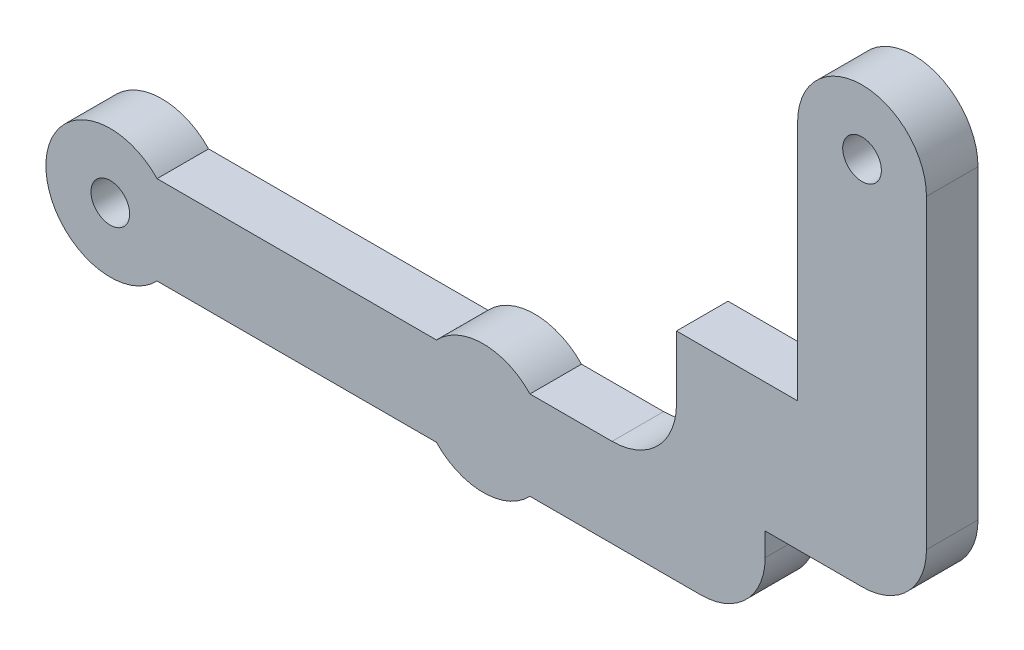
ISO-10303-21;
HEADER;
FILE_DESCRIPTION(('STEP AP214'),'2;1');
FILE_NAME('part.step','',(''),(''),'','','');
FILE_SCHEMA(('AUTOMOTIVE_DESIGN { 1 0 10303 214 1 1 1 1 }'));
ENDSEC;
DATA;
#1=APPLICATION_CONTEXT('core data for automotive mechanical design processes');
#2=APPLICATION_PROTOCOL_DEFINITION('international standard','automotive_design',2000,#1);
#3=PRODUCT_CONTEXT('',#1,'mechanical');
#4=PRODUCT('Part','Part','',(#3));
#5=PRODUCT_RELATED_PRODUCT_CATEGORY('part','',(#4));
#6=PRODUCT_DEFINITION_FORMATION('','',#4);
#7=PRODUCT_DEFINITION_CONTEXT('part definition',#1,'design');
#8=PRODUCT_DEFINITION('design','',#6,#7);
#9=PRODUCT_DEFINITION_SHAPE('','',#8);
#10=(LENGTH_UNIT() NAMED_UNIT(*) SI_UNIT(.MILLI.,.METRE.));
#11=(NAMED_UNIT(*) PLANE_ANGLE_UNIT() SI_UNIT($,.RADIAN.));
#12=(NAMED_UNIT(*) SI_UNIT($,.STERADIAN.) SOLID_ANGLE_UNIT());
#13=UNCERTAINTY_MEASURE_WITH_UNIT(LENGTH_MEASURE(1.E-05),#10,'distance_accuracy_value','');
#14=(GEOMETRIC_REPRESENTATION_CONTEXT(3) GLOBAL_UNCERTAINTY_ASSIGNED_CONTEXT((#13)) GLOBAL_UNIT_ASSIGNED_CONTEXT((#10,
#11,#12)) REPRESENTATION_CONTEXT('',''));
#15=CARTESIAN_POINT('',(0.,0.,0.));
#16=DIRECTION('',(0.,0.,1.));
#17=DIRECTION('',(1.,0.,0.));
#18=AXIS2_PLACEMENT_3D('',#15,#16,#17);
#19=CARTESIAN_POINT('',(29.9959228132225,-17.400123785271,4.));
#20=DIRECTION('',(0.,0.,-1.));
#21=DIRECTION('',(-1.,0.,0.));
#22=AXIS2_PLACEMENT_3D('',#19,#20,#21);
#23=CYLINDRICAL_SURFACE('',#22,1.5);
#24=CARTESIAN_POINT('',(29.9959228132225,-17.400123785271,0.));
#25=DIRECTION('',(0.,0.,1.));
#26=DIRECTION('',(1.,0.,0.));
#27=AXIS2_PLACEMENT_3D('',#24,#25,#26);
#28=CIRCLE('',#27,1.5);
#29=CARTESIAN_POINT('',(31.4959228132225,-17.400123785271,0.));
#30=VERTEX_POINT('',#29);
#31=EDGE_CURVE('E355',#30,#30,#28,.T.);
#32=ORIENTED_EDGE('',*,*,#31,.F.);
#33=EDGE_LOOP('',(#32));
#34=FACE_BOUND('',#33,.T.);
#35=CARTESIAN_POINT('',(29.9959228132225,-17.400123785271,3.));
#36=DIRECTION('',(0.,0.,1.));
#37=DIRECTION('',(1.,0.,0.));
#38=AXIS2_PLACEMENT_3D('',#35,#36,#37);
#39=CIRCLE('',#38,1.5);
#40=CARTESIAN_POINT('',(31.4959228132225,-17.400123785271,3.));
#41=VERTEX_POINT('',#40);
#42=EDGE_CURVE('E384',#41,#41,#39,.T.);
#43=ORIENTED_EDGE('',*,*,#42,.T.);
#44=EDGE_LOOP('',(#43));
#45=FACE_BOUND('',#44,.T.);
#46=ADVANCED_FACE('F37',(#34,#45),#23,.F.);
#47=CARTESIAN_POINT('',(59.3959228132225,-9.04012378527096,4.));
#48=DIRECTION('',(0.,0.,-1.));
#49=DIRECTION('',(-1.,0.,0.));
#50=AXIS2_PLACEMENT_3D('',#47,#48,#49);
#51=CYLINDRICAL_SURFACE('',#50,1.5);
#52=CARTESIAN_POINT('',(59.3959228132225,-9.04012378527096,0.));
#53=DIRECTION('',(0.,0.,1.));
#54=DIRECTION('',(1.,0.,0.));
#55=AXIS2_PLACEMENT_3D('',#52,#53,#54);
#56=CIRCLE('',#55,1.5);
#57=CARTESIAN_POINT('',(60.8959228132225,-9.04012378527096,0.));
#58=VERTEX_POINT('',#57);
#59=EDGE_CURVE('E193',#58,#58,#56,.T.);
#60=ORIENTED_EDGE('',*,*,#59,.F.);
#61=EDGE_LOOP('',(#60));
#62=FACE_BOUND('',#61,.T.);
#63=CARTESIAN_POINT('',(59.3959228132225,-9.04012378527096,3.));
#64=DIRECTION('',(0.,0.,1.));
#65=DIRECTION('',(1.,0.,0.));
#66=AXIS2_PLACEMENT_3D('',#63,#64,#65);
#67=CIRCLE('',#66,1.5);
#68=CARTESIAN_POINT('',(60.8959228132225,-9.04012378527096,3.));
#69=VERTEX_POINT('',#68);
#70=EDGE_CURVE('E381',#69,#69,#67,.T.);
#71=ORIENTED_EDGE('',*,*,#70,.T.);
#72=EDGE_LOOP('',(#71));
#73=FACE_BOUND('',#72,.T.);
#74=ADVANCED_FACE('F329',(#62,#73),#51,.F.);
#75=CARTESIAN_POINT('',(59.3959228132225,1.23987621472904,4.));
#76=DIRECTION('',(0.,0.,-1.));
#77=DIRECTION('',(-1.,0.,0.));
#78=AXIS2_PLACEMENT_3D('',#75,#76,#77);
#79=CYLINDRICAL_SURFACE('',#78,1.5);
#80=CARTESIAN_POINT('',(59.3959228132225,1.23987621472904,0.));
#81=DIRECTION('',(0.,0.,1.));
#82=DIRECTION('',(1.,0.,0.));
#83=AXIS2_PLACEMENT_3D('',#80,#81,#82);
#84=CIRCLE('',#83,1.5);
#85=CARTESIAN_POINT('',(60.8959228132225,1.23987621472904,0.));
#86=VERTEX_POINT('',#85);
#87=EDGE_CURVE('E358',#86,#86,#84,.T.);
#88=ORIENTED_EDGE('',*,*,#87,.F.);
#89=EDGE_LOOP('',(#88));
#90=FACE_BOUND('',#89,.T.);
#91=CARTESIAN_POINT('',(59.3959228132225,1.23987621472904,3.));
#92=DIRECTION('',(0.,0.,1.));
#93=DIRECTION('',(1.,0.,0.));
#94=AXIS2_PLACEMENT_3D('',#91,#92,#93);
#95=CIRCLE('',#94,1.5);
#96=CARTESIAN_POINT('',(60.8959228132225,1.23987621472904,3.));
#97=VERTEX_POINT('',#96);
#98=EDGE_CURVE('E376',#97,#97,#95,.T.);
#99=ORIENTED_EDGE('',*,*,#98,.T.);
#100=EDGE_LOOP('',(#99));
#101=FACE_BOUND('',#100,.T.);
#102=ADVANCED_FACE('F335',(#90,#101),#79,.F.);
#103=CARTESIAN_POINT('',(59.3959228132225,-9.04012378527096,4.));
#104=DIRECTION('',(0.,0.,-1.));
#105=DIRECTION('',(-1.,0.,0.));
#106=AXIS2_PLACEMENT_3D('',#103,#104,#105);
#107=PLANE('',#106);
#108=DIRECTION('',(0.,1.,0.));
#109=VECTOR('',#108,1.);
#110=CARTESIAN_POINT('',(51.8759228132224,-15.840123785271,4.));
#111=LINE('',#110,#109);
#112=CARTESIAN_POINT('',(51.8759228132225,-15.840123785271,4.));
#113=VERTEX_POINT('',#112);
#114=CARTESIAN_POINT('',(51.8759228132224,-14.040123785271,4.));
#115=VERTEX_POINT('',#114);
#116=EDGE_CURVE('E222',#113,#115,#111,.T.);
#117=ORIENTED_EDGE('',*,*,#116,.T.);
#118=DIRECTION('',(1.,0.,0.));
#119=VECTOR('',#118,1.);
#120=CARTESIAN_POINT('',(51.8759228132224,-14.040123785271,4.));
#121=LINE('',#120,#119);
#122=CARTESIAN_POINT('',(59.3959228132225,-14.040123785271,4.));
#123=VERTEX_POINT('',#122);
#124=EDGE_CURVE('E124',#115,#123,#121,.T.);
#125=ORIENTED_EDGE('',*,*,#124,.T.);
#126=CARTESIAN_POINT('',(59.3959228132225,-9.04012378527096,4.));
#127=DIRECTION('',(0.,0.,1.));
#128=DIRECTION('',(-1.,0.,0.));
#129=AXIS2_PLACEMENT_3D('',#126,#127,#128);
#130=CIRCLE('',#129,5.);
#131=CARTESIAN_POINT('',(64.3959228132225,-9.04012378527096,4.));
#132=VERTEX_POINT('',#131);
#133=EDGE_CURVE('E264',#123,#132,#130,.T.);
#134=ORIENTED_EDGE('',*,*,#133,.T.);
#135=DIRECTION('',(0.,1.,0.));
#136=VECTOR('',#135,1.);
#137=CARTESIAN_POINT('',(64.3959228132225,-9.04012378527096,4.));
#138=LINE('',#137,#136);
#139=CARTESIAN_POINT('',(64.3959228132225,14.6998762147291,4.));
#140=VERTEX_POINT('',#139);
#141=EDGE_CURVE('E283',#132,#140,#138,.T.);
#142=ORIENTED_EDGE('',*,*,#141,.T.);
#143=CARTESIAN_POINT('',(59.3959228132225,14.6998762147291,4.));
#144=DIRECTION('',(0.,0.,1.));
#145=DIRECTION('',(1.,0.,0.));
#146=AXIS2_PLACEMENT_3D('',#143,#144,#145);
#147=CIRCLE('',#146,4.99999999999999);
#148=CARTESIAN_POINT('',(54.3959228132225,14.6998762147291,4.));
#149=VERTEX_POINT('',#148);
#150=EDGE_CURVE('E280',#140,#149,#147,.T.);
#151=ORIENTED_EDGE('',*,*,#150,.T.);
#152=DIRECTION('',(0.,-1.,0.));
#153=VECTOR('',#152,1.);
#154=CARTESIAN_POINT('',(54.3959228132225,14.6998762147291,4.));
#155=LINE('',#154,#153);
#156=CARTESIAN_POINT('',(54.3959228132225,-4.04012378527096,4.));
#157=VERTEX_POINT('',#156);
#158=EDGE_CURVE('E282',#149,#157,#155,.T.);
#159=ORIENTED_EDGE('',*,*,#158,.T.);
#160=DIRECTION('',(-1.,0.,0.));
#161=VECTOR('',#160,1.);
#162=CARTESIAN_POINT('',(54.3959228132225,-4.04012378527096,4.));
#163=LINE('',#162,#161);
#164=CARTESIAN_POINT('',(44.9959228132224,-4.04012378527096,4.));
#165=VERTEX_POINT('',#164);
#166=EDGE_CURVE('E285',#157,#165,#163,.T.);
#167=ORIENTED_EDGE('',*,*,#166,.T.);
#168=DIRECTION('',(0.,-1.,0.));
#169=VECTOR('',#168,1.);
#170=CARTESIAN_POINT('',(44.9959228132224,-4.04012378527096,4.));
#171=LINE('',#170,#169);
#172=CARTESIAN_POINT('',(44.9959228132225,-8.96012378527096,4.));
#173=VERTEX_POINT('',#172);
#174=EDGE_CURVE('E291',#165,#173,#171,.T.);
#175=ORIENTED_EDGE('',*,*,#174,.T.);
#176=CARTESIAN_POINT('',(39.9959228132224,-8.96012378527096,4.));
#177=DIRECTION('',(0.,0.,-1.));
#178=DIRECTION('',(-1.,0.,0.));
#179=AXIS2_PLACEMENT_3D('',#176,#177,#178);
#180=CIRCLE('',#179,5.);
#181=CARTESIAN_POINT('',(39.9959228132224,-13.960123785271,4.));
#182=VERTEX_POINT('',#181);
#183=EDGE_CURVE('E293',#173,#182,#180,.T.);
#184=ORIENTED_EDGE('',*,*,#183,.T.);
#185=DIRECTION('',(-1.,0.,0.));
#186=VECTOR('',#185,1.);
#187=CARTESIAN_POINT('',(39.9959228132224,-13.960123785271,4.));
#188=LINE('',#187,#186);
#189=CARTESIAN_POINT('',(33.624476243999,-13.960123785271,4.));
#190=VERTEX_POINT('',#189);
#191=EDGE_CURVE('E295',#182,#190,#188,.T.);
#192=ORIENTED_EDGE('',*,*,#191,.T.);
#193=CARTESIAN_POINT('',(29.9959228132225,-17.400123785271,4.));
#194=DIRECTION('',(0.,0.,1.));
#195=DIRECTION('',(1.,0.,0.));
#196=AXIS2_PLACEMENT_3D('',#193,#194,#195);
#197=CIRCLE('',#196,4.99999999999999);
#198=CARTESIAN_POINT('',(26.367369382446,-13.960123785271,4.));
#199=VERTEX_POINT('',#198);
#200=EDGE_CURVE('E297',#190,#199,#197,.T.);
#201=ORIENTED_EDGE('',*,*,#200,.T.);
#202=DIRECTION('',(-1.,0.,0.));
#203=VECTOR('',#202,1.);
#204=CARTESIAN_POINT('',(26.367369382446,-13.960123785271,4.));
#205=LINE('',#204,#203);
#206=CARTESIAN_POINT('',(4.68447624399896,-13.960123785271,4.));
#207=VERTEX_POINT('',#206);
#208=EDGE_CURVE('E299',#199,#207,#205,.T.);
#209=ORIENTED_EDGE('',*,*,#208,.T.);
#210=CARTESIAN_POINT('',(1.05592281322246,-17.400123785271,4.));
#211=DIRECTION('',(0.,0.,1.));
#212=DIRECTION('',(1.,0.,0.));
#213=AXIS2_PLACEMENT_3D('',#210,#211,#212);
#214=CIRCLE('',#213,4.99999999999999);
#215=CARTESIAN_POINT('',(4.68447624399895,-20.840123785271,4.));
#216=VERTEX_POINT('',#215);
#217=EDGE_CURVE('E301',#207,#216,#214,.T.);
#218=ORIENTED_EDGE('',*,*,#217,.T.);
#219=DIRECTION('',(1.,0.,0.));
#220=VECTOR('',#219,1.);
#221=CARTESIAN_POINT('',(4.68447624399896,-20.840123785271,4.));
#222=LINE('',#221,#220);
#223=CARTESIAN_POINT('',(26.367369382446,-20.840123785271,4.));
#224=VERTEX_POINT('',#223);
#225=EDGE_CURVE('E171',#216,#224,#222,.T.);
#226=ORIENTED_EDGE('',*,*,#225,.T.);
#227=CARTESIAN_POINT('',(29.9959228132225,-17.400123785271,4.));
#228=DIRECTION('',(0.,0.,1.));
#229=DIRECTION('',(1.,0.,0.));
#230=AXIS2_PLACEMENT_3D('',#227,#228,#229);
#231=CIRCLE('',#230,4.99999999999999);
#232=CARTESIAN_POINT('',(33.624476243999,-20.840123785271,4.));
#233=VERTEX_POINT('',#232);
#234=EDGE_CURVE('E164',#224,#233,#231,.T.);
#235=ORIENTED_EDGE('',*,*,#234,.T.);
#236=DIRECTION('',(1.,0.,0.));
#237=VECTOR('',#236,1.);
#238=CARTESIAN_POINT('',(33.624476243999,-20.840123785271,4.));
#239=LINE('',#238,#237);
#240=CARTESIAN_POINT('',(46.8759228132224,-20.840123785271,4.));
#241=VERTEX_POINT('',#240);
#242=EDGE_CURVE('E169',#233,#241,#239,.T.);
#243=ORIENTED_EDGE('',*,*,#242,.T.);
#244=CARTESIAN_POINT('',(46.8759228132224,-15.840123785271,4.));
#245=DIRECTION('',(0.,0.,1.));
#246=DIRECTION('',(-1.,0.,0.));
#247=AXIS2_PLACEMENT_3D('',#244,#245,#246);
#248=CIRCLE('',#247,5.);
#249=EDGE_CURVE('E54',#241,#113,#248,.T.);
#250=ORIENTED_EDGE('',*,*,#249,.T.);
#251=EDGE_LOOP('',(#117,#125,#134,#142,#151,#159,#167,#175,#184,#192,#201,#209,#218,#226,#235,
#243,#250));
#252=FACE_BOUND('',#251,.T.);
#253=CARTESIAN_POINT('',(59.3959228132225,14.6998762147291,4.));
#254=DIRECTION('',(0.,0.,1.));
#255=DIRECTION('',(1.,0.,0.));
#256=AXIS2_PLACEMENT_3D('',#253,#254,#255);
#257=CIRCLE('',#256,1.5);
#258=CARTESIAN_POINT('',(60.8959228132225,14.6998762147291,4.));
#259=VERTEX_POINT('',#258);
#260=EDGE_CURVE('E359',#259,#259,#257,.T.);
#261=ORIENTED_EDGE('',*,*,#260,.F.);
#262=EDGE_LOOP('',(#261));
#263=FACE_BOUND('',#262,.T.);
#264=CARTESIAN_POINT('',(1.05592281322246,-17.400123785271,4.));
#265=DIRECTION('',(0.,0.,1.));
#266=DIRECTION('',(1.,0.,0.));
#267=AXIS2_PLACEMENT_3D('',#264,#265,#266);
#268=CIRCLE('',#267,1.5);
#269=CARTESIAN_POINT('',(2.55592281322246,-17.400123785271,4.));
#270=VERTEX_POINT('',#269);
#271=EDGE_CURVE('E372',#270,#270,#268,.T.);
#272=ORIENTED_EDGE('',*,*,#271,.F.);
#273=EDGE_LOOP('',(#272));
#274=FACE_BOUND('',#273,.T.);
#275=ADVANCED_FACE('F166',(#252,#263,#274),#107,.F.);
#276=CARTESIAN_POINT('',(59.3959228132225,-9.04012378527096,0.));
#277=DIRECTION('',(0.,0.,-1.));
#278=DIRECTION('',(-1.,0.,0.));
#279=AXIS2_PLACEMENT_3D('',#276,#277,#278);
#280=PLANE('',#279);
#281=ORIENTED_EDGE('',*,*,#31,.T.);
#282=EDGE_LOOP('',(#281));
#283=FACE_BOUND('',#282,.T.);
#284=ORIENTED_EDGE('',*,*,#87,.T.);
#285=EDGE_LOOP('',(#284));
#286=FACE_BOUND('',#285,.T.);
#287=DIRECTION('',(0.,1.,0.));
#288=VECTOR('',#287,1.);
#289=CARTESIAN_POINT('',(51.8759228132224,-15.840123785271,0.));
#290=LINE('',#289,#288);
#291=CARTESIAN_POINT('',(51.8759228132225,-15.840123785271,0.));
#292=VERTEX_POINT('',#291);
#293=CARTESIAN_POINT('',(51.8759228132224,-14.040123785271,0.));
#294=VERTEX_POINT('',#293);
#295=EDGE_CURVE('E189',#292,#294,#290,.T.);
#296=ORIENTED_EDGE('',*,*,#295,.F.);
#297=CARTESIAN_POINT('',(46.8759228132224,-15.840123785271,0.));
#298=DIRECTION('',(0.,0.,1.));
#299=DIRECTION('',(-1.,0.,0.));
#300=AXIS2_PLACEMENT_3D('',#297,#298,#299);
#301=CIRCLE('',#300,5.);
#302=CARTESIAN_POINT('',(46.8759228132224,-20.840123785271,0.));
#303=VERTEX_POINT('',#302);
#304=EDGE_CURVE('E116',#303,#292,#301,.T.);
#305=ORIENTED_EDGE('',*,*,#304,.F.);
#306=DIRECTION('',(1.,0.,0.));
#307=VECTOR('',#306,1.);
#308=CARTESIAN_POINT('',(33.624476243999,-20.840123785271,0.));
#309=LINE('',#308,#307);
#310=CARTESIAN_POINT('',(33.624476243999,-20.840123785271,0.));
#311=VERTEX_POINT('',#310);
#312=EDGE_CURVE('E110',#311,#303,#309,.T.);
#313=ORIENTED_EDGE('',*,*,#312,.F.);
#314=CARTESIAN_POINT('',(29.9959228132225,-17.400123785271,0.));
#315=DIRECTION('',(0.,0.,1.));
#316=DIRECTION('',(1.,0.,0.));
#317=AXIS2_PLACEMENT_3D('',#314,#315,#316);
#318=CIRCLE('',#317,4.99999999999999);
#319=CARTESIAN_POINT('',(26.367369382446,-20.840123785271,0.));
#320=VERTEX_POINT('',#319);
#321=EDGE_CURVE('E179',#320,#311,#318,.T.);
#322=ORIENTED_EDGE('',*,*,#321,.F.);
#323=DIRECTION('',(1.,0.,0.));
#324=VECTOR('',#323,1.);
#325=CARTESIAN_POINT('',(4.68447624399896,-20.840123785271,0.));
#326=LINE('',#325,#324);
#327=CARTESIAN_POINT('',(4.68447624399895,-20.840123785271,0.));
#328=VERTEX_POINT('',#327);
#329=EDGE_CURVE('E217',#328,#320,#326,.T.);
#330=ORIENTED_EDGE('',*,*,#329,.F.);
#331=CARTESIAN_POINT('',(1.05592281322246,-17.400123785271,0.));
#332=DIRECTION('',(0.,0.,1.));
#333=DIRECTION('',(1.,0.,0.));
#334=AXIS2_PLACEMENT_3D('',#331,#332,#333);
#335=CIRCLE('',#334,4.99999999999999);
#336=CARTESIAN_POINT('',(4.68447624399896,-13.960123785271,0.));
#337=VERTEX_POINT('',#336);
#338=EDGE_CURVE('E215',#337,#328,#335,.T.);
#339=ORIENTED_EDGE('',*,*,#338,.F.);
#340=DIRECTION('',(-1.,0.,0.));
#341=VECTOR('',#340,1.);
#342=CARTESIAN_POINT('',(26.367369382446,-13.960123785271,0.));
#343=LINE('',#342,#341);
#344=CARTESIAN_POINT('',(26.367369382446,-13.960123785271,0.));
#345=VERTEX_POINT('',#344);
#346=EDGE_CURVE('E213',#345,#337,#343,.T.);
#347=ORIENTED_EDGE('',*,*,#346,.F.);
#348=CARTESIAN_POINT('',(29.9959228132225,-17.400123785271,0.));
#349=DIRECTION('',(0.,0.,1.));
#350=DIRECTION('',(1.,0.,0.));
#351=AXIS2_PLACEMENT_3D('',#348,#349,#350);
#352=CIRCLE('',#351,4.99999999999999);
#353=CARTESIAN_POINT('',(33.624476243999,-13.960123785271,0.));
#354=VERTEX_POINT('',#353);
#355=EDGE_CURVE('E211',#354,#345,#352,.T.);
#356=ORIENTED_EDGE('',*,*,#355,.F.);
#357=DIRECTION('',(-1.,0.,0.));
#358=VECTOR('',#357,1.);
#359=CARTESIAN_POINT('',(39.9959228132224,-13.960123785271,0.));
#360=LINE('',#359,#358);
#361=CARTESIAN_POINT('',(39.9959228132224,-13.960123785271,0.));
#362=VERTEX_POINT('',#361);
#363=EDGE_CURVE('E209',#362,#354,#360,.T.);
#364=ORIENTED_EDGE('',*,*,#363,.F.);
#365=CARTESIAN_POINT('',(39.9959228132224,-8.96012378527096,0.));
#366=DIRECTION('',(0.,0.,-1.));
#367=DIRECTION('',(-1.,0.,0.));
#368=AXIS2_PLACEMENT_3D('',#365,#366,#367);
#369=CIRCLE('',#368,5.);
#370=CARTESIAN_POINT('',(44.9959228132225,-8.96012378527096,0.));
#371=VERTEX_POINT('',#370);
#372=EDGE_CURVE('E207',#371,#362,#369,.T.);
#373=ORIENTED_EDGE('',*,*,#372,.F.);
#374=DIRECTION('',(0.,-1.,0.));
#375=VECTOR('',#374,1.);
#376=CARTESIAN_POINT('',(44.9959228132224,-4.04012378527096,0.));
#377=LINE('',#376,#375);
#378=CARTESIAN_POINT('',(44.9959228132224,-4.04012378527096,0.));
#379=VERTEX_POINT('',#378);
#380=EDGE_CURVE('E205',#379,#371,#377,.T.);
#381=ORIENTED_EDGE('',*,*,#380,.F.);
#382=DIRECTION('',(-1.,0.,0.));
#383=VECTOR('',#382,1.);
#384=CARTESIAN_POINT('',(54.3959228132225,-4.04012378527096,0.));
#385=LINE('',#384,#383);
#386=CARTESIAN_POINT('',(54.3959228132225,-4.04012378527096,0.));
#387=VERTEX_POINT('',#386);
#388=EDGE_CURVE('E203',#387,#379,#385,.T.);
#389=ORIENTED_EDGE('',*,*,#388,.F.);
#390=DIRECTION('',(0.,-1.,0.));
#391=VECTOR('',#390,1.);
#392=CARTESIAN_POINT('',(54.3959228132225,14.6998762147291,0.));
#393=LINE('',#392,#391);
#394=CARTESIAN_POINT('',(54.3959228132225,14.6998762147291,0.));
#395=VERTEX_POINT('',#394);
#396=EDGE_CURVE('E201',#395,#387,#393,.T.);
#397=ORIENTED_EDGE('',*,*,#396,.F.);
#398=CARTESIAN_POINT('',(59.3959228132225,14.6998762147291,0.));
#399=DIRECTION('',(0.,0.,1.));
#400=DIRECTION('',(1.,0.,0.));
#401=AXIS2_PLACEMENT_3D('',#398,#399,#400);
#402=CIRCLE('',#401,4.99999999999999);
#403=CARTESIAN_POINT('',(64.3959228132225,14.6998762147291,0.));
#404=VERTEX_POINT('',#403);
#405=EDGE_CURVE('E199',#404,#395,#402,.T.);
#406=ORIENTED_EDGE('',*,*,#405,.F.);
#407=DIRECTION('',(0.,1.,0.));
#408=VECTOR('',#407,1.);
#409=CARTESIAN_POINT('',(64.3959228132225,-9.04012378527096,0.));
#410=LINE('',#409,#408);
#411=CARTESIAN_POINT('',(64.3959228132225,-9.04012378527096,0.));
#412=VERTEX_POINT('',#411);
#413=EDGE_CURVE('E197',#412,#404,#410,.T.);
#414=ORIENTED_EDGE('',*,*,#413,.F.);
#415=CARTESIAN_POINT('',(59.3959228132225,-9.04012378527096,0.));
#416=DIRECTION('',(0.,0.,1.));
#417=DIRECTION('',(-1.,0.,0.));
#418=AXIS2_PLACEMENT_3D('',#415,#416,#417);
#419=CIRCLE('',#418,5.);
#420=CARTESIAN_POINT('',(59.3959228132225,-14.040123785271,0.));
#421=VERTEX_POINT('',#420);
#422=EDGE_CURVE('E195',#421,#412,#419,.T.);
#423=ORIENTED_EDGE('',*,*,#422,.F.);
#424=DIRECTION('',(1.,0.,0.));
#425=VECTOR('',#424,1.);
#426=CARTESIAN_POINT('',(51.8759228132224,-14.040123785271,0.));
#427=LINE('',#426,#425);
#428=EDGE_CURVE('E192',#294,#421,#427,.T.);
#429=ORIENTED_EDGE('',*,*,#428,.F.);
#430=EDGE_LOOP('',(#296,#305,#313,#322,#330,#339,#347,#356,#364,#373,#381,#389,#397,#406,#414,
#423,#429));
#431=FACE_BOUND('',#430,.T.);
#432=ORIENTED_EDGE('',*,*,#59,.T.);
#433=EDGE_LOOP('',(#432));
#434=FACE_BOUND('',#433,.T.);
#435=CARTESIAN_POINT('',(59.3959228132225,14.6998762147291,0.));
#436=DIRECTION('',(0.,0.,1.));
#437=DIRECTION('',(1.,0.,0.));
#438=AXIS2_PLACEMENT_3D('',#435,#436,#437);
#439=CIRCLE('',#438,1.5);
#440=CARTESIAN_POINT('',(60.8959228132225,14.6998762147291,0.));
#441=VERTEX_POINT('',#440);
#442=EDGE_CURVE('E364',#441,#441,#439,.T.);
#443=ORIENTED_EDGE('',*,*,#442,.T.);
#444=EDGE_LOOP('',(#443));
#445=FACE_BOUND('',#444,.T.);
#446=CARTESIAN_POINT('',(1.05592281322246,-17.400123785271,0.));
#447=DIRECTION('',(0.,0.,1.));
#448=DIRECTION('',(1.,0.,0.));
#449=AXIS2_PLACEMENT_3D('',#446,#447,#448);
#450=CIRCLE('',#449,1.5);
#451=CARTESIAN_POINT('',(2.55592281322246,-17.400123785271,0.));
#452=VERTEX_POINT('',#451);
#453=EDGE_CURVE('E373',#452,#452,#450,.T.);
#454=ORIENTED_EDGE('',*,*,#453,.T.);
#455=EDGE_LOOP('',(#454));
#456=FACE_BOUND('',#455,.T.);
#457=ADVANCED_FACE('F268',(#283,#286,#431,#434,#445,#456),#280,.T.);
#458=CARTESIAN_POINT('',(51.8759228132224,-15.840123785271,4.));
#459=DIRECTION('',(-1.,0.,0.));
#460=DIRECTION('',(0.,0.,1.));
#461=AXIS2_PLACEMENT_3D('',#458,#459,#460);
#462=PLANE('',#461);
#463=ORIENTED_EDGE('',*,*,#295,.T.);
#464=DIRECTION('',(0.,0.,-1.));
#465=VECTOR('',#464,1.);
#466=CARTESIAN_POINT('',(51.8759228132224,-14.040123785271,4.));
#467=LINE('',#466,#465);
#468=EDGE_CURVE('E11',#115,#294,#467,.T.);
#469=ORIENTED_EDGE('',*,*,#468,.F.);
#470=ORIENTED_EDGE('',*,*,#116,.F.);
#471=DIRECTION('',(0.,0.,-1.));
#472=VECTOR('',#471,1.);
#473=CARTESIAN_POINT('',(51.8759228132225,-15.840123785271,4.));
#474=LINE('',#473,#472);
#475=EDGE_CURVE('E185',#113,#292,#474,.T.);
#476=ORIENTED_EDGE('',*,*,#475,.T.);
#477=EDGE_LOOP('',(#463,#469,#470,#476));
#478=FACE_BOUND('',#477,.T.);
#479=ADVANCED_FACE('F39',(#478),#462,.F.);
#480=CARTESIAN_POINT('',(51.8759228132224,-14.040123785271,4.));
#481=DIRECTION('',(0.,1.,0.));
#482=DIRECTION('',(-1.,0.,0.));
#483=AXIS2_PLACEMENT_3D('',#480,#481,#482);
#484=PLANE('',#483);
#485=ORIENTED_EDGE('',*,*,#428,.T.);
#486=DIRECTION('',(0.,0.,-1.));
#487=VECTOR('',#486,1.);
#488=CARTESIAN_POINT('',(59.3959228132225,-14.040123785271,4.));
#489=LINE('',#488,#487);
#490=EDGE_CURVE('E46',#123,#421,#489,.T.);
#491=ORIENTED_EDGE('',*,*,#490,.F.);
#492=ORIENTED_EDGE('',*,*,#124,.F.);
#493=ORIENTED_EDGE('',*,*,#468,.T.);
#494=EDGE_LOOP('',(#485,#491,#492,#493));
#495=FACE_BOUND('',#494,.T.);
#496=ADVANCED_FACE('F352',(#495),#484,.F.);
#497=CARTESIAN_POINT('',(59.3959228132225,-9.04012378527096,4.));
#498=DIRECTION('',(0.,0.,-1.));
#499=DIRECTION('',(-1.,0.,0.));
#500=AXIS2_PLACEMENT_3D('',#497,#498,#499);
#501=CYLINDRICAL_SURFACE('',#500,5.);
#502=ORIENTED_EDGE('',*,*,#422,.T.);
#503=DIRECTION('',(0.,0.,-1.));
#504=VECTOR('',#503,1.);
#505=CARTESIAN_POINT('',(64.3959228132225,-9.04012378527096,4.));
#506=LINE('',#505,#504);
#507=EDGE_CURVE('E256',#132,#412,#506,.T.);
#508=ORIENTED_EDGE('',*,*,#507,.F.);
#509=ORIENTED_EDGE('',*,*,#133,.F.);
#510=ORIENTED_EDGE('',*,*,#490,.T.);
#511=EDGE_LOOP('',(#502,#508,#509,#510));
#512=FACE_BOUND('',#511,.T.);
#513=ADVANCED_FACE('F262',(#512),#501,.T.);
#514=CARTESIAN_POINT('',(64.3959228132225,-9.04012378527096,4.));
#515=DIRECTION('',(-1.,0.,0.));
#516=DIRECTION('',(0.,0.,1.));
#517=AXIS2_PLACEMENT_3D('',#514,#515,#516);
#518=PLANE('',#517);
#519=ORIENTED_EDGE('',*,*,#413,.T.);
#520=DIRECTION('',(0.,0.,-1.));
#521=VECTOR('',#520,1.);
#522=CARTESIAN_POINT('',(64.3959228132225,14.6998762147291,4.));
#523=LINE('',#522,#521);
#524=EDGE_CURVE('E253',#140,#404,#523,.T.);
#525=ORIENTED_EDGE('',*,*,#524,.F.);
#526=ORIENTED_EDGE('',*,*,#141,.F.);
#527=ORIENTED_EDGE('',*,*,#507,.T.);
#528=EDGE_LOOP('',(#519,#525,#526,#527));
#529=FACE_BOUND('',#528,.T.);
#530=ADVANCED_FACE('F274',(#529),#518,.F.);
#531=CARTESIAN_POINT('',(59.3959228132225,14.6998762147291,4.));
#532=DIRECTION('',(0.,0.,-1.));
#533=DIRECTION('',(-1.,0.,0.));
#534=AXIS2_PLACEMENT_3D('',#531,#532,#533);
#535=CYLINDRICAL_SURFACE('',#534,4.99999999999999);
#536=ORIENTED_EDGE('',*,*,#405,.T.);
#537=DIRECTION('',(0.,0.,-1.));
#538=VECTOR('',#537,1.);
#539=CARTESIAN_POINT('',(54.3959228132225,14.6998762147291,4.));
#540=LINE('',#539,#538);
#541=EDGE_CURVE('E250',#149,#395,#540,.T.);
#542=ORIENTED_EDGE('',*,*,#541,.F.);
#543=ORIENTED_EDGE('',*,*,#150,.F.);
#544=ORIENTED_EDGE('',*,*,#524,.T.);
#545=EDGE_LOOP('',(#536,#542,#543,#544));
#546=FACE_BOUND('',#545,.T.);
#547=ADVANCED_FACE('F278',(#546),#535,.T.);
#548=CARTESIAN_POINT('',(54.3959228132225,14.6998762147291,4.));
#549=DIRECTION('',(1.,0.,0.));
#550=DIRECTION('',(0.,1.,0.));
#551=AXIS2_PLACEMENT_3D('',#548,#549,#550);
#552=PLANE('',#551);
#553=ORIENTED_EDGE('',*,*,#396,.T.);
#554=DIRECTION('',(0.,0.,-1.));
#555=VECTOR('',#554,1.);
#556=CARTESIAN_POINT('',(54.3959228132225,-4.04012378527096,4.));
#557=LINE('',#556,#555);
#558=EDGE_CURVE('E247',#157,#387,#557,.T.);
#559=ORIENTED_EDGE('',*,*,#558,.F.);
#560=ORIENTED_EDGE('',*,*,#158,.F.);
#561=ORIENTED_EDGE('',*,*,#541,.T.);
#562=EDGE_LOOP('',(#553,#559,#560,#561));
#563=FACE_BOUND('',#562,.T.);
#564=ADVANCED_FACE('F522',(#563),#552,.F.);
#565=CARTESIAN_POINT('',(54.3959228132225,-4.04012378527096,4.));
#566=DIRECTION('',(0.,-1.,0.));
#567=DIRECTION('',(0.,0.,-1.));
#568=AXIS2_PLACEMENT_3D('',#565,#566,#567);
#569=PLANE('',#568);
#570=ORIENTED_EDGE('',*,*,#388,.T.);
#571=DIRECTION('',(0.,0.,-1.));
#572=VECTOR('',#571,1.);
#573=CARTESIAN_POINT('',(44.9959228132224,-4.04012378527096,4.));
#574=LINE('',#573,#572);
#575=EDGE_CURVE('E244',#165,#379,#574,.T.);
#576=ORIENTED_EDGE('',*,*,#575,.F.);
#577=ORIENTED_EDGE('',*,*,#166,.F.);
#578=ORIENTED_EDGE('',*,*,#558,.T.);
#579=EDGE_LOOP('',(#570,#576,#577,#578));
#580=FACE_BOUND('',#579,.T.);
#581=ADVANCED_FACE('F511',(#580),#569,.F.);
#582=CARTESIAN_POINT('',(44.9959228132224,-4.04012378527096,4.));
#583=DIRECTION('',(1.,0.,0.));
#584=DIRECTION('',(0.,1.,0.));
#585=AXIS2_PLACEMENT_3D('',#582,#583,#584);
#586=PLANE('',#585);
#587=ORIENTED_EDGE('',*,*,#380,.T.);
#588=DIRECTION('',(0.,0.,-1.));
#589=VECTOR('',#588,1.);
#590=CARTESIAN_POINT('',(44.9959228132225,-8.96012378527096,4.));
#591=LINE('',#590,#589);
#592=EDGE_CURVE('E241',#173,#371,#591,.T.);
#593=ORIENTED_EDGE('',*,*,#592,.F.);
#594=ORIENTED_EDGE('',*,*,#174,.F.);
#595=ORIENTED_EDGE('',*,*,#575,.T.);
#596=EDGE_LOOP('',(#587,#593,#594,#595));
#597=FACE_BOUND('',#596,.T.);
#598=ADVANCED_FACE('F500',(#597),#586,.F.);
#599=CARTESIAN_POINT('',(39.9959228132224,-8.96012378527096,4.));
#600=DIRECTION('',(0.,0.,-1.));
#601=DIRECTION('',(-1.,0.,0.));
#602=AXIS2_PLACEMENT_3D('',#599,#600,#601);
#603=CYLINDRICAL_SURFACE('',#602,5.);
#604=ORIENTED_EDGE('',*,*,#372,.T.);
#605=DIRECTION('',(0.,0.,-1.));
#606=VECTOR('',#605,1.);
#607=CARTESIAN_POINT('',(39.9959228132224,-13.960123785271,4.));
#608=LINE('',#607,#606);
#609=EDGE_CURVE('E238',#182,#362,#608,.T.);
#610=ORIENTED_EDGE('',*,*,#609,.F.);
#611=ORIENTED_EDGE('',*,*,#183,.F.);
#612=ORIENTED_EDGE('',*,*,#592,.T.);
#613=EDGE_LOOP('',(#604,#610,#611,#612));
#614=FACE_BOUND('',#613,.T.);
#615=ADVANCED_FACE('F489',(#614),#603,.F.);
#616=CARTESIAN_POINT('',(39.9959228132224,-13.960123785271,4.));
#617=DIRECTION('',(0.,-1.,0.));
#618=DIRECTION('',(1.,0.,0.));
#619=AXIS2_PLACEMENT_3D('',#616,#617,#618);
#620=PLANE('',#619);
#621=ORIENTED_EDGE('',*,*,#363,.T.);
#622=DIRECTION('',(0.,0.,-1.));
#623=VECTOR('',#622,1.);
#624=CARTESIAN_POINT('',(33.624476243999,-13.960123785271,4.));
#625=LINE('',#624,#623);
#626=EDGE_CURVE('E235',#190,#354,#625,.T.);
#627=ORIENTED_EDGE('',*,*,#626,.F.);
#628=ORIENTED_EDGE('',*,*,#191,.F.);
#629=ORIENTED_EDGE('',*,*,#609,.T.);
#630=EDGE_LOOP('',(#621,#627,#628,#629));
#631=FACE_BOUND('',#630,.T.);
#632=ADVANCED_FACE('F478',(#631),#620,.F.);
#633=CARTESIAN_POINT('',(29.9959228132225,-17.400123785271,4.));
#634=DIRECTION('',(0.,0.,-1.));
#635=DIRECTION('',(-1.,0.,0.));
#636=AXIS2_PLACEMENT_3D('',#633,#634,#635);
#637=CYLINDRICAL_SURFACE('',#636,4.99999999999999);
#638=ORIENTED_EDGE('',*,*,#355,.T.);
#639=DIRECTION('',(0.,0.,-1.));
#640=VECTOR('',#639,1.);
#641=CARTESIAN_POINT('',(26.367369382446,-13.960123785271,4.));
#642=LINE('',#641,#640);
#643=EDGE_CURVE('E232',#199,#345,#642,.T.);
#644=ORIENTED_EDGE('',*,*,#643,.F.);
#645=ORIENTED_EDGE('',*,*,#200,.F.);
#646=ORIENTED_EDGE('',*,*,#626,.T.);
#647=EDGE_LOOP('',(#638,#644,#645,#646));
#648=FACE_BOUND('',#647,.T.);
#649=ADVANCED_FACE('F467',(#648),#637,.T.);
#650=CARTESIAN_POINT('',(26.367369382446,-13.960123785271,4.));
#651=DIRECTION('',(0.,-1.,0.));
#652=DIRECTION('',(1.,0.,0.));
#653=AXIS2_PLACEMENT_3D('',#650,#651,#652);
#654=PLANE('',#653);
#655=ORIENTED_EDGE('',*,*,#346,.T.);
#656=DIRECTION('',(0.,0.,-1.));
#657=VECTOR('',#656,1.);
#658=CARTESIAN_POINT('',(4.68447624399896,-13.960123785271,4.));
#659=LINE('',#658,#657);
#660=EDGE_CURVE('E229',#207,#337,#659,.T.);
#661=ORIENTED_EDGE('',*,*,#660,.F.);
#662=ORIENTED_EDGE('',*,*,#208,.F.);
#663=ORIENTED_EDGE('',*,*,#643,.T.);
#664=EDGE_LOOP('',(#655,#661,#662,#663));
#665=FACE_BOUND('',#664,.T.);
#666=ADVANCED_FACE('F457',(#665),#654,.F.);
#667=CARTESIAN_POINT('',(1.05592281322246,-17.400123785271,4.));
#668=DIRECTION('',(0.,0.,-1.));
#669=DIRECTION('',(-1.,0.,0.));
#670=AXIS2_PLACEMENT_3D('',#667,#668,#669);
#671=CYLINDRICAL_SURFACE('',#670,4.99999999999999);
#672=ORIENTED_EDGE('',*,*,#338,.T.);
#673=DIRECTION('',(0.,0.,-1.));
#674=VECTOR('',#673,1.);
#675=CARTESIAN_POINT('',(4.68447624399895,-20.840123785271,4.));
#676=LINE('',#675,#674);
#677=EDGE_CURVE('E226',#216,#328,#676,.T.);
#678=ORIENTED_EDGE('',*,*,#677,.F.);
#679=ORIENTED_EDGE('',*,*,#217,.F.);
#680=ORIENTED_EDGE('',*,*,#660,.T.);
#681=EDGE_LOOP('',(#672,#678,#679,#680));
#682=FACE_BOUND('',#681,.T.);
#683=ADVANCED_FACE('F307',(#682),#671,.T.);
#684=CARTESIAN_POINT('',(4.68447624399896,-20.840123785271,4.));
#685=DIRECTION('',(0.,1.,0.));
#686=DIRECTION('',(-1.,0.,0.));
#687=AXIS2_PLACEMENT_3D('',#684,#685,#686);
#688=PLANE('',#687);
#689=ORIENTED_EDGE('',*,*,#329,.T.);
#690=DIRECTION('',(0.,0.,-1.));
#691=VECTOR('',#690,1.);
#692=CARTESIAN_POINT('',(26.367369382446,-20.840123785271,4.));
#693=LINE('',#692,#691);
#694=EDGE_CURVE('E180',#224,#320,#693,.T.);
#695=ORIENTED_EDGE('',*,*,#694,.F.);
#696=ORIENTED_EDGE('',*,*,#225,.F.);
#697=ORIENTED_EDGE('',*,*,#677,.T.);
#698=EDGE_LOOP('',(#689,#695,#696,#697));
#699=FACE_BOUND('',#698,.T.);
#700=ADVANCED_FACE('F311',(#699),#688,.F.);
#701=CARTESIAN_POINT('',(29.9959228132225,-17.400123785271,4.));
#702=DIRECTION('',(0.,0.,-1.));
#703=DIRECTION('',(-1.,0.,0.));
#704=AXIS2_PLACEMENT_3D('',#701,#702,#703);
#705=CYLINDRICAL_SURFACE('',#704,4.99999999999999);
#706=ORIENTED_EDGE('',*,*,#321,.T.);
#707=DIRECTION('',(0.,0.,-1.));
#708=VECTOR('',#707,1.);
#709=CARTESIAN_POINT('',(33.624476243999,-20.840123785271,4.));
#710=LINE('',#709,#708);
#711=EDGE_CURVE('E176',#233,#311,#710,.T.);
#712=ORIENTED_EDGE('',*,*,#711,.F.);
#713=ORIENTED_EDGE('',*,*,#234,.F.);
#714=ORIENTED_EDGE('',*,*,#694,.T.);
#715=EDGE_LOOP('',(#706,#712,#713,#714));
#716=FACE_BOUND('',#715,.T.);
#717=ADVANCED_FACE('F177',(#716),#705,.T.);
#718=CARTESIAN_POINT('',(33.624476243999,-20.840123785271,4.));
#719=DIRECTION('',(0.,1.,0.));
#720=DIRECTION('',(-1.,0.,0.));
#721=AXIS2_PLACEMENT_3D('',#718,#719,#720);
#722=PLANE('',#721);
#723=ORIENTED_EDGE('',*,*,#312,.T.);
#724=DIRECTION('',(0.,0.,-1.));
#725=VECTOR('',#724,1.);
#726=CARTESIAN_POINT('',(46.8759228132224,-20.840123785271,4.));
#727=LINE('',#726,#725);
#728=EDGE_CURVE('E181',#241,#303,#727,.T.);
#729=ORIENTED_EDGE('',*,*,#728,.F.);
#730=ORIENTED_EDGE('',*,*,#242,.F.);
#731=ORIENTED_EDGE('',*,*,#711,.T.);
#732=EDGE_LOOP('',(#723,#729,#730,#731));
#733=FACE_BOUND('',#732,.T.);
#734=ADVANCED_FACE('F183',(#733),#722,.F.);
#735=CARTESIAN_POINT('',(46.8759228132224,-15.840123785271,4.));
#736=DIRECTION('',(0.,0.,-1.));
#737=DIRECTION('',(-1.,0.,0.));
#738=AXIS2_PLACEMENT_3D('',#735,#736,#737);
#739=CYLINDRICAL_SURFACE('',#738,5.);
#740=ORIENTED_EDGE('',*,*,#304,.T.);
#741=ORIENTED_EDGE('',*,*,#475,.F.);
#742=ORIENTED_EDGE('',*,*,#249,.F.);
#743=ORIENTED_EDGE('',*,*,#728,.T.);
#744=EDGE_LOOP('',(#740,#741,#742,#743));
#745=FACE_BOUND('',#744,.T.);
#746=ADVANCED_FACE('F315',(#745),#739,.T.);
#747=CARTESIAN_POINT('',(59.3959228132225,14.6998762147291,4.));
#748=DIRECTION('',(0.,0.,-1.));
#749=DIRECTION('',(-1.,0.,0.));
#750=AXIS2_PLACEMENT_3D('',#747,#748,#749);
#751=CYLINDRICAL_SURFACE('',#750,1.5);
#752=ORIENTED_EDGE('',*,*,#260,.T.);
#753=EDGE_LOOP('',(#752));
#754=FACE_BOUND('',#753,.T.);
#755=ORIENTED_EDGE('',*,*,#442,.F.);
#756=EDGE_LOOP('',(#755));
#757=FACE_BOUND('',#756,.T.);
#758=ADVANCED_FACE('F317',(#754,#757),#751,.F.);
#759=CARTESIAN_POINT('',(1.05592281322246,-17.400123785271,4.));
#760=DIRECTION('',(0.,0.,-1.));
#761=DIRECTION('',(-1.,0.,0.));
#762=AXIS2_PLACEMENT_3D('',#759,#760,#761);
#763=CYLINDRICAL_SURFACE('',#762,1.5);
#764=ORIENTED_EDGE('',*,*,#271,.T.);
#765=EDGE_LOOP('',(#764));
#766=FACE_BOUND('',#765,.T.);
#767=ORIENTED_EDGE('',*,*,#453,.F.);
#768=EDGE_LOOP('',(#767));
#769=FACE_BOUND('',#768,.T.);
#770=ADVANCED_FACE('F323',(#766,#769),#763,.F.);
#771=CARTESIAN_POINT('',(59.3959228132225,1.23987621472904,3.));
#772=DIRECTION('',(0.,0.,1.));
#773=DIRECTION('',(1.,0.,0.));
#774=AXIS2_PLACEMENT_3D('',#771,#772,#773);
#775=PLANE('',#774);
#776=ORIENTED_EDGE('',*,*,#98,.F.);
#777=EDGE_LOOP('',(#776));
#778=FACE_BOUND('',#777,.T.);
#779=ADVANCED_FACE('F395',(#778),#775,.F.);
#780=CARTESIAN_POINT('',(59.3959228132225,-9.04012378527096,3.));
#781=DIRECTION('',(0.,0.,1.));
#782=DIRECTION('',(1.,0.,0.));
#783=AXIS2_PLACEMENT_3D('',#780,#781,#782);
#784=PLANE('',#783);
#785=ORIENTED_EDGE('',*,*,#70,.F.);
#786=EDGE_LOOP('',(#785));
#787=FACE_BOUND('',#786,.T.);
#788=ADVANCED_FACE('F390',(#787),#784,.F.);
#789=CARTESIAN_POINT('',(29.9959228132225,-17.400123785271,3.));
#790=DIRECTION('',(0.,0.,1.));
#791=DIRECTION('',(1.,0.,0.));
#792=AXIS2_PLACEMENT_3D('',#789,#790,#791);
#793=PLANE('',#792);
#794=ORIENTED_EDGE('',*,*,#42,.F.);
#795=EDGE_LOOP('',(#794));
#796=FACE_BOUND('',#795,.T.);
#797=ADVANCED_FACE('F388',(#796),#793,.F.);
#798=CLOSED_SHELL('',(#46,#74,#102,#275,#457,#479,#496,#513,#530,#547,#564,#581,#598,#615,#632,
#649,#666,#683,#700,#717,#734,#746,#758,#770,#779,#788,#797));
#799=MANIFOLD_SOLID_BREP('B2',#798);
#800=ADVANCED_BREP_SHAPE_REPRESENTATION('',(#18,#799),#14);
#801=SHAPE_DEFINITION_REPRESENTATION(#9,#800);
ENDSEC;
END-ISO-10303-21;
